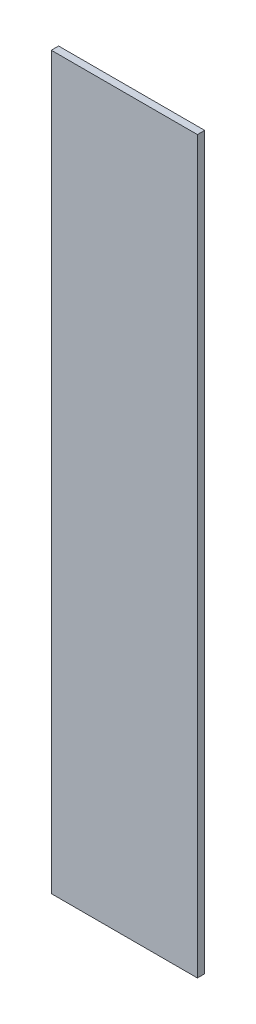
ISO-10303-21;
HEADER;
FILE_DESCRIPTION(('STEP AP214'),'2;1');
FILE_NAME('part.step','',(''),(''),'','','');
FILE_SCHEMA(('AUTOMOTIVE_DESIGN { 1 0 10303 214 1 1 1 1 }'));
ENDSEC;
DATA;
#1=APPLICATION_CONTEXT('core data for automotive mechanical design processes');
#2=APPLICATION_PROTOCOL_DEFINITION('international standard','automotive_design',2000,#1);
#3=PRODUCT_CONTEXT('',#1,'mechanical');
#4=PRODUCT('Part','Part','',(#3));
#5=PRODUCT_RELATED_PRODUCT_CATEGORY('part','',(#4));
#6=PRODUCT_DEFINITION_FORMATION('','',#4);
#7=PRODUCT_DEFINITION_CONTEXT('part definition',#1,'design');
#8=PRODUCT_DEFINITION('design','',#6,#7);
#9=PRODUCT_DEFINITION_SHAPE('','',#8);
#10=(LENGTH_UNIT() NAMED_UNIT(*) SI_UNIT(.MILLI.,.METRE.));
#11=(NAMED_UNIT(*) PLANE_ANGLE_UNIT() SI_UNIT($,.RADIAN.));
#12=(NAMED_UNIT(*) SI_UNIT($,.STERADIAN.) SOLID_ANGLE_UNIT());
#13=UNCERTAINTY_MEASURE_WITH_UNIT(LENGTH_MEASURE(1.E-05),#10,'distance_accuracy_value','');
#14=(GEOMETRIC_REPRESENTATION_CONTEXT(3) GLOBAL_UNCERTAINTY_ASSIGNED_CONTEXT((#13)) GLOBAL_UNIT_ASSIGNED_CONTEXT((#10,
#11,#12)) REPRESENTATION_CONTEXT('',''));
#15=CARTESIAN_POINT('',(0.,0.,0.));
#16=DIRECTION('',(0.,0.,1.));
#17=DIRECTION('',(1.,0.,0.));
#18=AXIS2_PLACEMENT_3D('',#15,#16,#17);
#19=CARTESIAN_POINT('',(13.4231805929919,47.0350404312669,1.));
#20=DIRECTION('',(1.,0.,0.));
#21=DIRECTION('',(0.,1.,0.));
#22=AXIS2_PLACEMENT_3D('',#19,#20,#21);
#23=PLANE('',#22);
#24=DIRECTION('',(0.,-1.,0.));
#25=VECTOR('',#24,1.);
#26=CARTESIAN_POINT('',(13.4231805929919,47.0350404312669,0.));
#27=LINE('',#26,#25);
#28=CARTESIAN_POINT('',(13.4231805929919,47.0350404312669,0.));
#29=VERTEX_POINT('',#28);
#30=CARTESIAN_POINT('',(13.4231805929919,-52.9649595687332,0.));
#31=VERTEX_POINT('',#30);
#32=EDGE_CURVE('E95',#29,#31,#27,.T.);
#33=ORIENTED_EDGE('',*,*,#32,.T.);
#34=DIRECTION('',(0.,0.,-1.));
#35=VECTOR('',#34,1.);
#36=CARTESIAN_POINT('',(13.4231805929919,-52.9649595687332,1.));
#37=LINE('',#36,#35);
#38=CARTESIAN_POINT('',(13.4231805929919,-52.9649595687332,1.));
#39=VERTEX_POINT('',#38);
#40=EDGE_CURVE('E11',#39,#31,#37,.T.);
#41=ORIENTED_EDGE('',*,*,#40,.F.);
#42=DIRECTION('',(0.,-1.,0.));
#43=VECTOR('',#42,1.);
#44=CARTESIAN_POINT('',(13.4231805929919,47.0350404312669,1.));
#45=LINE('',#44,#43);
#46=CARTESIAN_POINT('',(13.4231805929919,47.0350404312669,1.));
#47=VERTEX_POINT('',#46);
#48=EDGE_CURVE('E83',#47,#39,#45,.T.);
#49=ORIENTED_EDGE('',*,*,#48,.F.);
#50=DIRECTION('',(0.,0.,-1.));
#51=VECTOR('',#50,1.);
#52=CARTESIAN_POINT('',(13.4231805929919,47.0350404312669,1.));
#53=LINE('',#52,#51);
#54=EDGE_CURVE('E91',#47,#29,#53,.T.);
#55=ORIENTED_EDGE('',*,*,#54,.T.);
#56=EDGE_LOOP('',(#33,#41,#49,#55));
#57=FACE_BOUND('',#56,.T.);
#58=ADVANCED_FACE('F32',(#57),#23,.F.);
#59=CARTESIAN_POINT('',(13.4231805929919,-52.9649595687332,1.));
#60=DIRECTION('',(0.,1.,0.));
#61=DIRECTION('',(-1.,0.,0.));
#62=AXIS2_PLACEMENT_3D('',#59,#60,#61);
#63=PLANE('',#62);
#64=DIRECTION('',(1.,0.,0.));
#65=VECTOR('',#64,1.);
#66=CARTESIAN_POINT('',(13.4231805929919,-52.9649595687332,0.));
#67=LINE('',#66,#65);
#68=CARTESIAN_POINT('',(33.4231805929919,-52.9649595687332,0.));
#69=VERTEX_POINT('',#68);
#70=EDGE_CURVE('E87',#31,#69,#67,.T.);
#71=ORIENTED_EDGE('',*,*,#70,.T.);
#72=DIRECTION('',(0.,0.,-1.));
#73=VECTOR('',#72,1.);
#74=CARTESIAN_POINT('',(33.4231805929919,-52.9649595687332,1.));
#75=LINE('',#74,#73);
#76=CARTESIAN_POINT('',(33.4231805929919,-52.9649595687332,1.));
#77=VERTEX_POINT('',#76);
#78=EDGE_CURVE('E40',#77,#69,#75,.T.);
#79=ORIENTED_EDGE('',*,*,#78,.F.);
#80=DIRECTION('',(1.,0.,0.));
#81=VECTOR('',#80,1.);
#82=CARTESIAN_POINT('',(13.4231805929919,-52.9649595687332,1.));
#83=LINE('',#82,#81);
#84=EDGE_CURVE('E78',#39,#77,#83,.T.);
#85=ORIENTED_EDGE('',*,*,#84,.F.);
#86=ORIENTED_EDGE('',*,*,#40,.T.);
#87=EDGE_LOOP('',(#71,#79,#85,#86));
#88=FACE_BOUND('',#87,.T.);
#89=ADVANCED_FACE('F86',(#88),#63,.F.);
#90=CARTESIAN_POINT('',(33.4231805929919,47.0350404312669,1.));
#91=DIRECTION('',(-1.,0.,0.));
#92=DIRECTION('',(0.,0.,1.));
#93=AXIS2_PLACEMENT_3D('',#90,#91,#92);
#94=PLANE('',#93);
#95=DIRECTION('',(0.,1.,0.));
#96=VECTOR('',#95,1.);
#97=CARTESIAN_POINT('',(33.4231805929919,47.0350404312669,0.));
#98=LINE('',#97,#96);
#99=CARTESIAN_POINT('',(33.4231805929919,47.0350404312669,0.));
#100=VERTEX_POINT('',#99);
#101=EDGE_CURVE('E65',#69,#100,#98,.T.);
#102=ORIENTED_EDGE('',*,*,#101,.T.);
#103=DIRECTION('',(0.,0.,-1.));
#104=VECTOR('',#103,1.);
#105=CARTESIAN_POINT('',(33.4231805929919,47.0350404312669,1.));
#106=LINE('',#105,#104);
#107=CARTESIAN_POINT('',(33.4231805929919,47.0350404312669,1.));
#108=VERTEX_POINT('',#107);
#109=EDGE_CURVE('E88',#108,#100,#106,.T.);
#110=ORIENTED_EDGE('',*,*,#109,.F.);
#111=DIRECTION('',(0.,1.,0.));
#112=VECTOR('',#111,1.);
#113=CARTESIAN_POINT('',(33.4231805929919,47.0350404312669,1.));
#114=LINE('',#113,#112);
#115=EDGE_CURVE('E81',#77,#108,#114,.T.);
#116=ORIENTED_EDGE('',*,*,#115,.F.);
#117=ORIENTED_EDGE('',*,*,#78,.T.);
#118=EDGE_LOOP('',(#102,#110,#116,#117));
#119=FACE_BOUND('',#118,.T.);
#120=ADVANCED_FACE('F89',(#119),#94,.F.);
#121=CARTESIAN_POINT('',(13.4231805929919,47.0350404312669,1.));
#122=DIRECTION('',(0.,-1.,0.));
#123=DIRECTION('',(0.,0.,-1.));
#124=AXIS2_PLACEMENT_3D('',#121,#122,#123);
#125=PLANE('',#124);
#126=DIRECTION('',(-1.,0.,0.));
#127=VECTOR('',#126,1.);
#128=CARTESIAN_POINT('',(13.4231805929919,47.0350404312669,0.));
#129=LINE('',#128,#127);
#130=EDGE_CURVE('E71',#100,#29,#129,.T.);
#131=ORIENTED_EDGE('',*,*,#130,.T.);
#132=ORIENTED_EDGE('',*,*,#54,.F.);
#133=DIRECTION('',(-1.,0.,0.));
#134=VECTOR('',#133,1.);
#135=CARTESIAN_POINT('',(13.4231805929919,47.0350404312669,1.));
#136=LINE('',#135,#134);
#137=EDGE_CURVE('E48',#108,#47,#136,.T.);
#138=ORIENTED_EDGE('',*,*,#137,.F.);
#139=ORIENTED_EDGE('',*,*,#109,.T.);
#140=EDGE_LOOP('',(#131,#132,#138,#139));
#141=FACE_BOUND('',#140,.T.);
#142=ADVANCED_FACE('F102',(#141),#125,.F.);
#143=CARTESIAN_POINT('',(0.,0.,1.));
#144=DIRECTION('',(0.,0.,1.));
#145=DIRECTION('',(1.,0.,0.));
#146=AXIS2_PLACEMENT_3D('',#143,#144,#145);
#147=PLANE('',#146);
#148=ORIENTED_EDGE('',*,*,#48,.T.);
#149=ORIENTED_EDGE('',*,*,#84,.T.);
#150=ORIENTED_EDGE('',*,*,#115,.T.);
#151=ORIENTED_EDGE('',*,*,#137,.T.);
#152=EDGE_LOOP('',(#148,#149,#150,#151));
#153=FACE_BOUND('',#152,.T.);
#154=ADVANCED_FACE('F79',(#153),#147,.T.);
#155=CARTESIAN_POINT('',(0.,0.,0.));
#156=DIRECTION('',(0.,0.,1.));
#157=DIRECTION('',(1.,0.,0.));
#158=AXIS2_PLACEMENT_3D('',#155,#156,#157);
#159=PLANE('',#158);
#160=ORIENTED_EDGE('',*,*,#32,.F.);
#161=ORIENTED_EDGE('',*,*,#130,.F.);
#162=ORIENTED_EDGE('',*,*,#101,.F.);
#163=ORIENTED_EDGE('',*,*,#70,.F.);
#164=EDGE_LOOP('',(#160,#161,#162,#163));
#165=FACE_BOUND('',#164,.T.);
#166=ADVANCED_FACE('F105',(#165),#159,.F.);
#167=CLOSED_SHELL('',(#58,#89,#120,#142,#154,#166));
#168=MANIFOLD_SOLID_BREP('B2',#167);
#169=ADVANCED_BREP_SHAPE_REPRESENTATION('',(#18,#168),#14);
#170=SHAPE_DEFINITION_REPRESENTATION(#9,#169);
ENDSEC;
END-ISO-10303-21;
